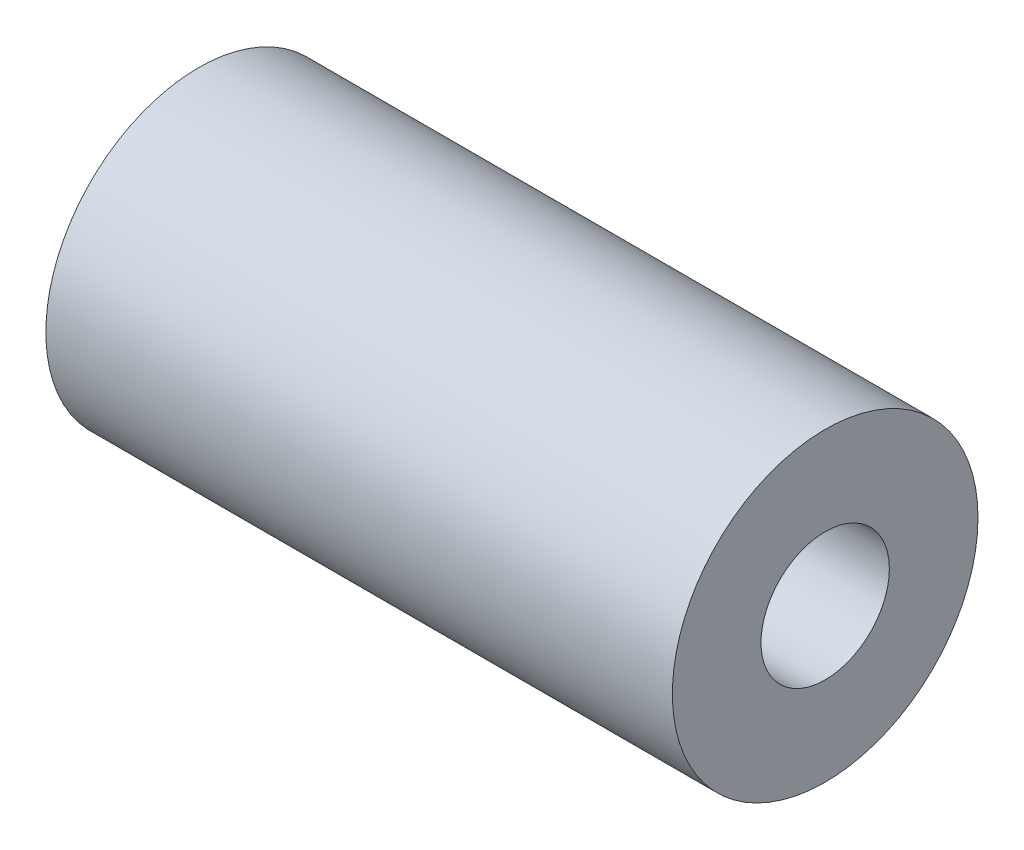
ISO-10303-21;
HEADER;
FILE_DESCRIPTION(('STEP AP214'),'2;1');
FILE_NAME('part.step','',(''),(''),'','','');
FILE_SCHEMA(('AUTOMOTIVE_DESIGN { 1 0 10303 214 1 1 1 1 }'));
ENDSEC;
DATA;
#1=APPLICATION_CONTEXT('core data for automotive mechanical design processes');
#2=APPLICATION_PROTOCOL_DEFINITION('international standard','automotive_design',2000,#1);
#3=PRODUCT_CONTEXT('',#1,'mechanical');
#4=PRODUCT('Part','Part','',(#3));
#5=PRODUCT_RELATED_PRODUCT_CATEGORY('part','',(#4));
#6=PRODUCT_DEFINITION_FORMATION('','',#4);
#7=PRODUCT_DEFINITION_CONTEXT('part definition',#1,'design');
#8=PRODUCT_DEFINITION('design','',#6,#7);
#9=PRODUCT_DEFINITION_SHAPE('','',#8);
#10=(LENGTH_UNIT() NAMED_UNIT(*) SI_UNIT(.MILLI.,.METRE.));
#11=(NAMED_UNIT(*) PLANE_ANGLE_UNIT() SI_UNIT($,.RADIAN.));
#12=(NAMED_UNIT(*) SI_UNIT($,.STERADIAN.) SOLID_ANGLE_UNIT());
#13=UNCERTAINTY_MEASURE_WITH_UNIT(LENGTH_MEASURE(1.E-05),#10,'distance_accuracy_value','');
#14=(GEOMETRIC_REPRESENTATION_CONTEXT(3) GLOBAL_UNCERTAINTY_ASSIGNED_CONTEXT((#13)) GLOBAL_UNIT_ASSIGNED_CONTEXT((#10,
#11,#12)) REPRESENTATION_CONTEXT('',''));
#15=CARTESIAN_POINT('',(0.,0.,0.));
#16=DIRECTION('',(0.,0.,1.));
#17=DIRECTION('',(1.,0.,0.));
#18=AXIS2_PLACEMENT_3D('',#15,#16,#17);
#19=CARTESIAN_POINT('',(41.,0.,0.));
#20=DIRECTION('',(-1.,0.,0.));
#21=DIRECTION('',(0.,0.,1.));
#22=AXIS2_PLACEMENT_3D('',#19,#20,#21);
#23=CYLINDRICAL_SURFACE('',#22,10.);
#24=CARTESIAN_POINT('',(41.,0.,0.));
#25=DIRECTION('',(1.,0.,0.));
#26=DIRECTION('',(0.,0.,-1.));
#27=AXIS2_PLACEMENT_3D('',#24,#25,#26);
#28=CIRCLE('',#27,10.);
#29=CARTESIAN_POINT('',(41.,0.,-10.));
#30=VERTEX_POINT('',#29);
#31=EDGE_CURVE('E10',#30,#30,#28,.T.);
#32=ORIENTED_EDGE('',*,*,#31,.F.);
#33=EDGE_LOOP('',(#32));
#34=FACE_BOUND('',#33,.T.);
#35=CARTESIAN_POINT('',(0.,0.,0.));
#36=DIRECTION('',(1.,0.,0.));
#37=DIRECTION('',(0.,0.,-1.));
#38=AXIS2_PLACEMENT_3D('',#35,#36,#37);
#39=CIRCLE('',#38,10.);
#40=CARTESIAN_POINT('',(0.,0.,-10.));
#41=VERTEX_POINT('',#40);
#42=EDGE_CURVE('E34',#41,#41,#39,.T.);
#43=ORIENTED_EDGE('',*,*,#42,.T.);
#44=EDGE_LOOP('',(#43));
#45=FACE_BOUND('',#44,.T.);
#46=ADVANCED_FACE('F31',(#34,#45),#23,.T.);
#47=CARTESIAN_POINT('',(41.,0.,0.));
#48=DIRECTION('',(1.,0.,0.));
#49=DIRECTION('',(0.,0.,-1.));
#50=AXIS2_PLACEMENT_3D('',#47,#48,#49);
#51=PLANE('',#50);
#52=CARTESIAN_POINT('',(41.,0.,0.));
#53=DIRECTION('',(1.,0.,0.));
#54=DIRECTION('',(0.,0.,-1.));
#55=AXIS2_PLACEMENT_3D('',#52,#53,#54);
#56=CIRCLE('',#55,4.19999999999998);
#57=CARTESIAN_POINT('',(41.,0.,-4.19999999999998));
#58=VERTEX_POINT('',#57);
#59=EDGE_CURVE('E45',#58,#58,#56,.T.);
#60=ORIENTED_EDGE('',*,*,#59,.F.);
#61=EDGE_LOOP('',(#60));
#62=FACE_BOUND('',#61,.T.);
#63=ORIENTED_EDGE('',*,*,#31,.T.);
#64=EDGE_LOOP('',(#63));
#65=FACE_BOUND('',#64,.T.);
#66=ADVANCED_FACE('F51',(#62,#65),#51,.T.);
#67=CARTESIAN_POINT('',(0.,0.,0.));
#68=DIRECTION('',(1.,0.,0.));
#69=DIRECTION('',(0.,0.,-1.));
#70=AXIS2_PLACEMENT_3D('',#67,#68,#69);
#71=PLANE('',#70);
#72=CARTESIAN_POINT('',(0.,0.,0.));
#73=DIRECTION('',(1.,0.,0.));
#74=DIRECTION('',(0.,0.,-1.));
#75=AXIS2_PLACEMENT_3D('',#72,#73,#74);
#76=CIRCLE('',#75,4.19999999999999);
#77=CARTESIAN_POINT('',(0.,0.,-4.19999999999999));
#78=VERTEX_POINT('',#77);
#79=EDGE_CURVE('E41',#78,#78,#76,.T.);
#80=ORIENTED_EDGE('',*,*,#79,.T.);
#81=EDGE_LOOP('',(#80));
#82=FACE_BOUND('',#81,.T.);
#83=ORIENTED_EDGE('',*,*,#42,.F.);
#84=EDGE_LOOP('',(#83));
#85=FACE_BOUND('',#84,.T.);
#86=ADVANCED_FACE('F53',(#82,#85),#71,.F.);
#87=CARTESIAN_POINT('',(41.,0.,0.));
#88=DIRECTION('',(1.,0.,0.));
#89=DIRECTION('',(0.,0.,-1.));
#90=AXIS2_PLACEMENT_3D('',#87,#88,#89);
#91=CYLINDRICAL_SURFACE('',#90,4.19999999999999);
#92=ORIENTED_EDGE('',*,*,#79,.F.);
#93=EDGE_LOOP('',(#92));
#94=FACE_BOUND('',#93,.T.);
#95=ORIENTED_EDGE('',*,*,#59,.T.);
#96=EDGE_LOOP('',(#95));
#97=FACE_BOUND('',#96,.T.);
#98=ADVANCED_FACE('F49',(#94,#97),#91,.F.);
#99=CLOSED_SHELL('',(#46,#66,#86,#98));
#100=MANIFOLD_SOLID_BREP('B2',#99);
#101=ADVANCED_BREP_SHAPE_REPRESENTATION('',(#18,#100),#14);
#102=SHAPE_DEFINITION_REPRESENTATION(#9,#101);
ENDSEC;
END-ISO-10303-21;
